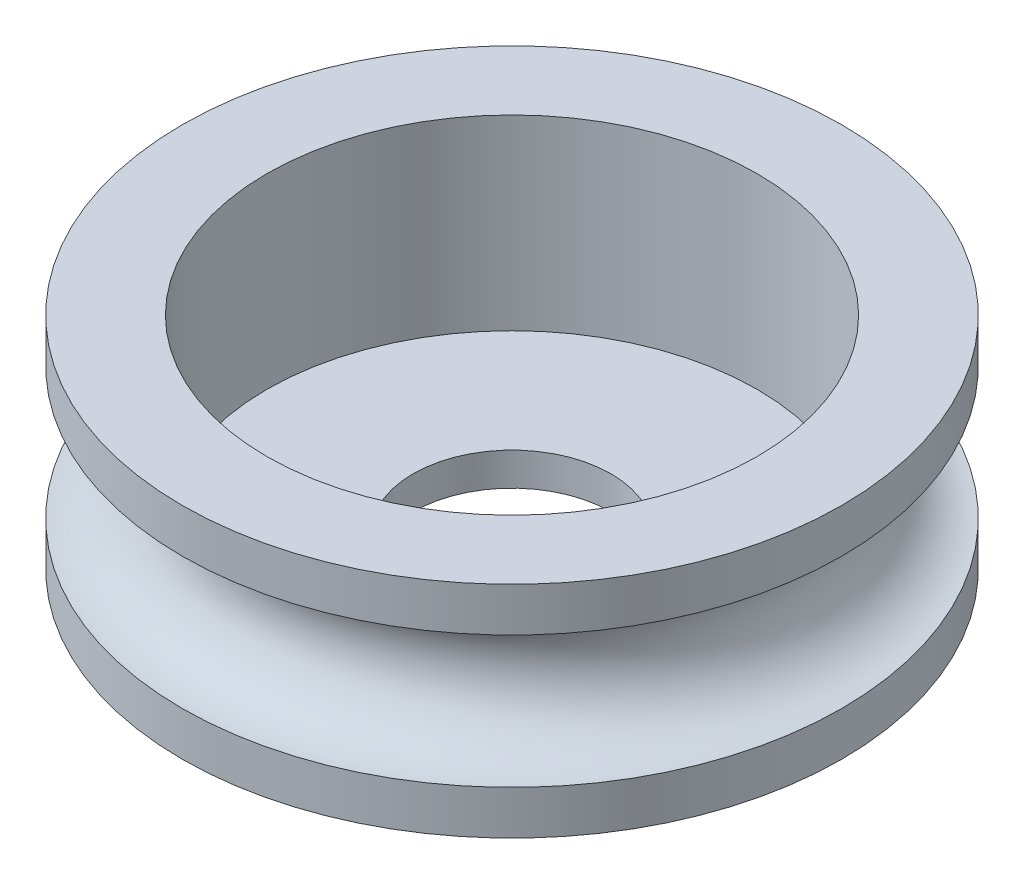
ISO-10303-21;
HEADER;
FILE_DESCRIPTION(('STEP AP214'),'2;1');
FILE_NAME('part.step','',(''),(''),'','','');
FILE_SCHEMA(('AUTOMOTIVE_DESIGN { 1 0 10303 214 1 1 1 1 }'));
ENDSEC;
DATA;
#1=APPLICATION_CONTEXT('core data for automotive mechanical design processes');
#2=APPLICATION_PROTOCOL_DEFINITION('international standard','automotive_design',2000,#1);
#3=PRODUCT_CONTEXT('',#1,'mechanical');
#4=PRODUCT('Part','Part','',(#3));
#5=PRODUCT_RELATED_PRODUCT_CATEGORY('part','',(#4));
#6=PRODUCT_DEFINITION_FORMATION('','',#4);
#7=PRODUCT_DEFINITION_CONTEXT('part definition',#1,'design');
#8=PRODUCT_DEFINITION('design','',#6,#7);
#9=PRODUCT_DEFINITION_SHAPE('','',#8);
#10=(LENGTH_UNIT() NAMED_UNIT(*) SI_UNIT(.MILLI.,.METRE.));
#11=(NAMED_UNIT(*) PLANE_ANGLE_UNIT() SI_UNIT($,.RADIAN.));
#12=(NAMED_UNIT(*) SI_UNIT($,.STERADIAN.) SOLID_ANGLE_UNIT());
#13=UNCERTAINTY_MEASURE_WITH_UNIT(LENGTH_MEASURE(1.E-05),#10,'distance_accuracy_value','');
#14=(GEOMETRIC_REPRESENTATION_CONTEXT(3) GLOBAL_UNCERTAINTY_ASSIGNED_CONTEXT((#13)) GLOBAL_UNIT_ASSIGNED_CONTEXT((#10,
#11,#12)) REPRESENTATION_CONTEXT('',''));
#15=CARTESIAN_POINT('',(0.,0.,0.));
#16=DIRECTION('',(0.,0.,1.));
#17=DIRECTION('',(1.,0.,0.));
#18=AXIS2_PLACEMENT_3D('',#15,#16,#17);
#19=CARTESIAN_POINT('',(0.,10.,0.));
#20=DIRECTION('',(0.,-1.,0.));
#21=DIRECTION('',(0.,0.,-1.));
#22=AXIS2_PLACEMENT_3D('',#19,#20,#21);
#23=CYLINDRICAL_SURFACE('',#22,15.);
#24=CARTESIAN_POINT('',(0.,2.,0.));
#25=DIRECTION('',(0.,-1.,0.));
#26=DIRECTION('',(0.,0.,-1.));
#27=AXIS2_PLACEMENT_3D('',#24,#25,#26);
#28=CIRCLE('',#27,15.);
#29=CARTESIAN_POINT('',(0.,2.,-15.));
#30=VERTEX_POINT('',#29);
#31=EDGE_CURVE('E54',#30,#30,#28,.T.);
#32=ORIENTED_EDGE('',*,*,#31,.T.);
#33=EDGE_LOOP('',(#32));
#34=FACE_BOUND('',#33,.T.);
#35=CARTESIAN_POINT('',(0.,0.,0.));
#36=DIRECTION('',(0.,1.,0.));
#37=DIRECTION('',(0.,0.,1.));
#38=AXIS2_PLACEMENT_3D('',#35,#36,#37);
#39=CIRCLE('',#38,15.);
#40=CARTESIAN_POINT('',(0.,0.,15.));
#41=VERTEX_POINT('',#40);
#42=EDGE_CURVE('E48',#41,#41,#39,.T.);
#43=ORIENTED_EDGE('',*,*,#42,.T.);
#44=EDGE_LOOP('',(#43));
#45=FACE_BOUND('',#44,.T.);
#46=ADVANCED_FACE('F39',(#34,#45),#23,.T.);
#47=CARTESIAN_POINT('',(0.,0.,0.));
#48=DIRECTION('',(0.,1.,0.));
#49=DIRECTION('',(0.,0.,1.));
#50=AXIS2_PLACEMENT_3D('',#47,#48,#49);
#51=PLANE('',#50);
#52=CARTESIAN_POINT('',(0.,0.,0.));
#53=DIRECTION('',(0.,-1.,0.));
#54=DIRECTION('',(0.,0.,-1.));
#55=AXIS2_PLACEMENT_3D('',#52,#53,#54);
#56=CIRCLE('',#55,4.5);
#57=CARTESIAN_POINT('',(0.,0.,-4.5));
#58=VERTEX_POINT('',#57);
#59=EDGE_CURVE('E71',#58,#58,#56,.T.);
#60=ORIENTED_EDGE('',*,*,#59,.F.);
#61=EDGE_LOOP('',(#60));
#62=FACE_BOUND('',#61,.T.);
#63=ORIENTED_EDGE('',*,*,#42,.F.);
#64=EDGE_LOOP('',(#63));
#65=FACE_BOUND('',#64,.T.);
#66=ADVANCED_FACE('F103',(#62,#65),#51,.F.);
#67=CARTESIAN_POINT('',(0.,5.,0.));
#68=DIRECTION('',(0.,-1.,0.));
#69=DIRECTION('',(0.,0.,-1.));
#70=AXIS2_PLACEMENT_3D('',#67,#68,#69);
#71=TOROIDAL_SURFACE('',#70,15.,3.);
#72=ORIENTED_EDGE('',*,*,#31,.F.);
#73=EDGE_LOOP('',(#72));
#74=FACE_BOUND('',#73,.T.);
#75=CARTESIAN_POINT('',(0.,8.,0.));
#76=DIRECTION('',(0.,-1.,0.));
#77=DIRECTION('',(0.,0.,-1.));
#78=AXIS2_PLACEMENT_3D('',#75,#76,#77);
#79=CIRCLE('',#78,15.);
#80=CARTESIAN_POINT('',(0.,8.,-15.));
#81=VERTEX_POINT('',#80);
#82=EDGE_CURVE('E59',#81,#81,#79,.T.);
#83=ORIENTED_EDGE('',*,*,#82,.T.);
#84=EDGE_LOOP('',(#83));
#85=FACE_BOUND('',#84,.T.);
#86=ADVANCED_FACE('F96',(#74,#85),#71,.F.);
#87=CARTESIAN_POINT('',(0.,10.,0.));
#88=DIRECTION('',(0.,1.,0.));
#89=DIRECTION('',(0.,0.,1.));
#90=AXIS2_PLACEMENT_3D('',#87,#88,#89);
#91=PLANE('',#90);
#92=CARTESIAN_POINT('',(0.,10.,0.));
#93=DIRECTION('',(0.,1.,0.));
#94=DIRECTION('',(0.,0.,1.));
#95=AXIS2_PLACEMENT_3D('',#92,#93,#94);
#96=CIRCLE('',#95,11.15);
#97=CARTESIAN_POINT('',(0.,10.,11.15));
#98=VERTEX_POINT('',#97);
#99=EDGE_CURVE('E64',#98,#98,#96,.T.);
#100=ORIENTED_EDGE('',*,*,#99,.F.);
#101=EDGE_LOOP('',(#100));
#102=FACE_BOUND('',#101,.T.);
#103=CARTESIAN_POINT('',(0.,10.,0.));
#104=DIRECTION('',(0.,1.,0.));
#105=DIRECTION('',(0.,0.,1.));
#106=AXIS2_PLACEMENT_3D('',#103,#104,#105);
#107=CIRCLE('',#106,15.);
#108=CARTESIAN_POINT('',(0.,10.,15.));
#109=VERTEX_POINT('',#108);
#110=EDGE_CURVE('E10',#109,#109,#107,.T.);
#111=ORIENTED_EDGE('',*,*,#110,.T.);
#112=EDGE_LOOP('',(#111));
#113=FACE_BOUND('',#112,.T.);
#114=ADVANCED_FACE('F94',(#102,#113),#91,.T.);
#115=ORIENTED_EDGE('',*,*,#82,.F.);
#116=EDGE_LOOP('',(#115));
#117=FACE_BOUND('',#116,.T.);
#118=ORIENTED_EDGE('',*,*,#110,.F.);
#119=EDGE_LOOP('',(#118));
#120=FACE_BOUND('',#119,.T.);
#121=ADVANCED_FACE('F41',(#117,#120),#23,.T.);
#122=CARTESIAN_POINT('',(0.,1.5,0.));
#123=DIRECTION('',(0.,1.,0.));
#124=DIRECTION('',(0.,0.,1.));
#125=AXIS2_PLACEMENT_3D('',#122,#123,#124);
#126=CYLINDRICAL_SURFACE('',#125,11.15);
#127=CARTESIAN_POINT('',(0.,1.5,0.));
#128=DIRECTION('',(0.,1.,0.));
#129=DIRECTION('',(0.,0.,1.));
#130=AXIS2_PLACEMENT_3D('',#127,#128,#129);
#131=CIRCLE('',#130,11.15);
#132=CARTESIAN_POINT('',(0.,1.5,11.15));
#133=VERTEX_POINT('',#132);
#134=EDGE_CURVE('E63',#133,#133,#131,.T.);
#135=ORIENTED_EDGE('',*,*,#134,.F.);
#136=EDGE_LOOP('',(#135));
#137=FACE_BOUND('',#136,.T.);
#138=ORIENTED_EDGE('',*,*,#99,.T.);
#139=EDGE_LOOP('',(#138));
#140=FACE_BOUND('',#139,.T.);
#141=ADVANCED_FACE('F85',(#137,#140),#126,.F.);
#142=CARTESIAN_POINT('',(0.,1.5,0.));
#143=DIRECTION('',(0.,1.,0.));
#144=DIRECTION('',(0.,0.,1.));
#145=AXIS2_PLACEMENT_3D('',#142,#143,#144);
#146=PLANE('',#145);
#147=CARTESIAN_POINT('',(0.,1.5,0.));
#148=DIRECTION('',(0.,1.,0.));
#149=DIRECTION('',(0.,0.,1.));
#150=AXIS2_PLACEMENT_3D('',#147,#148,#149);
#151=CIRCLE('',#150,4.5);
#152=CARTESIAN_POINT('',(0.,1.5,4.5));
#153=VERTEX_POINT('',#152);
#154=EDGE_CURVE('E43',#153,#153,#151,.T.);
#155=ORIENTED_EDGE('',*,*,#154,.F.);
#156=EDGE_LOOP('',(#155));
#157=FACE_BOUND('',#156,.T.);
#158=ORIENTED_EDGE('',*,*,#134,.T.);
#159=EDGE_LOOP('',(#158));
#160=FACE_BOUND('',#159,.T.);
#161=ADVANCED_FACE('F82',(#157,#160),#146,.T.);
#162=CARTESIAN_POINT('',(0.,10.,0.));
#163=DIRECTION('',(0.,-1.,0.));
#164=DIRECTION('',(0.,0.,-1.));
#165=AXIS2_PLACEMENT_3D('',#162,#163,#164);
#166=CYLINDRICAL_SURFACE('',#165,4.5);
#167=ORIENTED_EDGE('',*,*,#154,.T.);
#168=EDGE_LOOP('',(#167));
#169=FACE_BOUND('',#168,.T.);
#170=ORIENTED_EDGE('',*,*,#59,.T.);
#171=EDGE_LOOP('',(#170));
#172=FACE_BOUND('',#171,.T.);
#173=ADVANCED_FACE('F80',(#169,#172),#166,.F.);
#174=CLOSED_SHELL('',(#46,#66,#86,#114,#121,#141,#161,#173));
#175=MANIFOLD_SOLID_BREP('B2',#174);
#176=ADVANCED_BREP_SHAPE_REPRESENTATION('',(#18,#175),#14);
#177=SHAPE_DEFINITION_REPRESENTATION(#9,#176);
ENDSEC;
END-ISO-10303-21;
